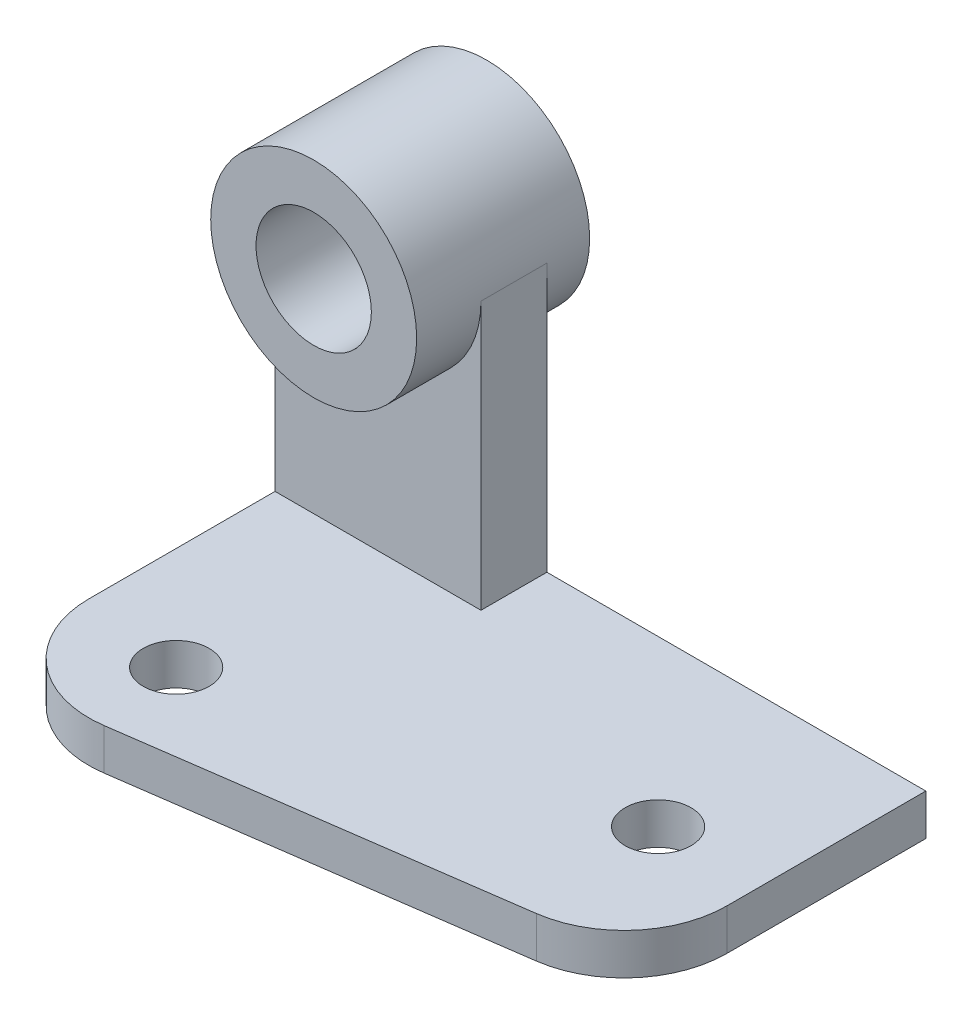
ISO-10303-21;
HEADER;
FILE_DESCRIPTION(('STEP AP214'),'2;1');
FILE_NAME('part.step','',(''),(''),'','','');
FILE_SCHEMA(('AUTOMOTIVE_DESIGN { 1 0 10303 214 1 1 1 1 }'));
ENDSEC;
DATA;
#1=APPLICATION_CONTEXT('core data for automotive mechanical design processes');
#2=APPLICATION_PROTOCOL_DEFINITION('international standard','automotive_design',2000,#1);
#3=PRODUCT_CONTEXT('',#1,'mechanical');
#4=PRODUCT('Part','Part','',(#3));
#5=PRODUCT_RELATED_PRODUCT_CATEGORY('part','',(#4));
#6=PRODUCT_DEFINITION_FORMATION('','',#4);
#7=PRODUCT_DEFINITION_CONTEXT('part definition',#1,'design');
#8=PRODUCT_DEFINITION('design','',#6,#7);
#9=PRODUCT_DEFINITION_SHAPE('','',#8);
#10=(LENGTH_UNIT() NAMED_UNIT(*) SI_UNIT(.MILLI.,.METRE.));
#11=(NAMED_UNIT(*) PLANE_ANGLE_UNIT() SI_UNIT($,.RADIAN.));
#12=(NAMED_UNIT(*) SI_UNIT($,.STERADIAN.) SOLID_ANGLE_UNIT());
#13=UNCERTAINTY_MEASURE_WITH_UNIT(LENGTH_MEASURE(1.E-05),#10,'distance_accuracy_value','');
#14=(GEOMETRIC_REPRESENTATION_CONTEXT(3) GLOBAL_UNCERTAINTY_ASSIGNED_CONTEXT((#13)) GLOBAL_UNIT_ASSIGNED_CONTEXT((#10,
#11,#12)) REPRESENTATION_CONTEXT('',''));
#15=CARTESIAN_POINT('',(0.,0.,0.));
#16=DIRECTION('',(0.,0.,1.));
#17=DIRECTION('',(1.,0.,0.));
#18=AXIS2_PLACEMENT_3D('',#15,#16,#17);
#19=CARTESIAN_POINT('',(-46.,10.,30.6160621336314));
#20=DIRECTION('',(0.,1.,0.));
#21=DIRECTION('',(0.,0.,1.));
#22=AXIS2_PLACEMENT_3D('',#19,#20,#21);
#23=PLANE('',#22);
#24=DIRECTION('',(0.,0.,-1.));
#25=VECTOR('',#24,1.);
#26=CARTESIAN_POINT('',(-21.,10.,-14.6160621336314));
#27=LINE('',#26,#25);
#28=CARTESIAN_POINT('',(-21.,10.,-14.6160621336314));
#29=VERTEX_POINT('',#28);
#30=CARTESIAN_POINT('',(-21.,10.,-30.6160621336314));
#31=VERTEX_POINT('',#30);
#32=EDGE_CURVE('E174',#29,#31,#27,.T.);
#33=ORIENTED_EDGE('',*,*,#32,.F.);
#34=DIRECTION('',(-1.,0.,0.));
#35=VECTOR('',#34,1.);
#36=CARTESIAN_POINT('',(-21.,10.,-14.6160621336314));
#37=LINE('',#36,#35);
#38=CARTESIAN_POINT('',(-71.,10.,-14.6160621336314));
#39=VERTEX_POINT('',#38);
#40=EDGE_CURVE('E181',#29,#39,#37,.T.);
#41=ORIENTED_EDGE('',*,*,#40,.T.);
#42=DIRECTION('',(0.,0.,1.));
#43=VECTOR('',#42,1.);
#44=CARTESIAN_POINT('',(-71.,10.,-30.6160621336314));
#45=LINE('',#44,#43);
#46=CARTESIAN_POINT('',(-71.,10.,30.6160621336314));
#47=VERTEX_POINT('',#46);
#48=EDGE_CURVE('E94',#39,#47,#45,.T.);
#49=ORIENTED_EDGE('',*,*,#48,.T.);
#50=CARTESIAN_POINT('',(-46.,10.,30.6160621336314));
#51=DIRECTION('',(0.,1.,0.));
#52=DIRECTION('',(0.,0.,1.));
#53=AXIS2_PLACEMENT_3D('',#50,#51,#52);
#54=CIRCLE('',#53,25.);
#55=CARTESIAN_POINT('',(-42.5132869538527,10.,55.3717247612774));
#56=VERTEX_POINT('',#55);
#57=EDGE_CURVE('E110',#47,#56,#54,.T.);
#58=ORIENTED_EDGE('',*,*,#57,.T.);
#59=DIRECTION('',(0.990226505105838,0.,-0.139468521845893));
#60=VECTOR('',#59,1.);
#61=CARTESIAN_POINT('',(-42.5132869538527,10.,55.3717247612774));
#62=LINE('',#61,#60);
#63=CARTESIAN_POINT('',(49.4867130461472,10.,42.4139782824042));
#64=VERTEX_POINT('',#63);
#65=EDGE_CURVE('E102',#56,#64,#62,.T.);
#66=ORIENTED_EDGE('',*,*,#65,.T.);
#67=CARTESIAN_POINT('',(46.,10.,17.6583156547582));
#68=DIRECTION('',(0.,1.,0.));
#69=DIRECTION('',(0.,0.,1.));
#70=AXIS2_PLACEMENT_3D('',#67,#68,#69);
#71=CIRCLE('',#70,25.);
#72=CARTESIAN_POINT('',(71.,10.,17.658315654758));
#73=VERTEX_POINT('',#72);
#74=EDGE_CURVE('E107',#64,#73,#71,.T.);
#75=ORIENTED_EDGE('',*,*,#74,.T.);
#76=DIRECTION('',(0.,0.,-1.));
#77=VECTOR('',#76,1.);
#78=CARTESIAN_POINT('',(71.,10.,17.658315654758));
#79=LINE('',#78,#77);
#80=CARTESIAN_POINT('',(71.,10.,-30.6160621336315));
#81=VERTEX_POINT('',#80);
#82=EDGE_CURVE('E60',#73,#81,#79,.T.);
#83=ORIENTED_EDGE('',*,*,#82,.T.);
#84=DIRECTION('',(-1.,0.,0.));
#85=VECTOR('',#84,1.);
#86=CARTESIAN_POINT('',(71.,10.,-30.6160621336315));
#87=LINE('',#86,#85);
#88=EDGE_CURVE('E143',#81,#31,#87,.T.);
#89=ORIENTED_EDGE('',*,*,#88,.T.);
#90=EDGE_LOOP('',(#33,#41,#49,#58,#66,#75,#83,#89));
#91=FACE_BOUND('',#90,.T.);
#92=CARTESIAN_POINT('',(46.,10.,9.38393786636855));
#93=DIRECTION('',(0.,1.,0.));
#94=DIRECTION('',(0.,0.,1.));
#95=AXIS2_PLACEMENT_3D('',#92,#93,#94);
#96=CIRCLE('',#95,8.00000000000001);
#97=CARTESIAN_POINT('',(46.,10.,17.3839378663686));
#98=VERTEX_POINT('',#97);
#99=EDGE_CURVE('E134',#98,#98,#96,.T.);
#100=ORIENTED_EDGE('',*,*,#99,.F.);
#101=EDGE_LOOP('',(#100));
#102=FACE_BOUND('',#101,.T.);
#103=CARTESIAN_POINT('',(-46.,10.,34.3839378663685));
#104=DIRECTION('',(0.,1.,0.));
#105=DIRECTION('',(0.,0.,1.));
#106=AXIS2_PLACEMENT_3D('',#103,#104,#105);
#107=CIRCLE('',#106,8.);
#108=CARTESIAN_POINT('',(-46.,10.,42.3839378663685));
#109=VERTEX_POINT('',#108);
#110=EDGE_CURVE('E168',#109,#109,#107,.T.);
#111=ORIENTED_EDGE('',*,*,#110,.F.);
#112=EDGE_LOOP('',(#111));
#113=FACE_BOUND('',#112,.T.);
#114=ADVANCED_FACE('F36',(#91,#102,#113),#23,.T.);
#115=CARTESIAN_POINT('',(-46.,0.,30.6160621336314));
#116=DIRECTION('',(0.,1.,0.));
#117=DIRECTION('',(0.,0.,1.));
#118=AXIS2_PLACEMENT_3D('',#115,#116,#117);
#119=PLANE('',#118);
#120=DIRECTION('',(-1.,0.,0.));
#121=VECTOR('',#120,1.);
#122=CARTESIAN_POINT('',(0.,0.,-30.6160621336314));
#123=LINE('',#122,#121);
#124=CARTESIAN_POINT('',(71.,0.,-30.6160621336315));
#125=VERTEX_POINT('',#124);
#126=CARTESIAN_POINT('',(-71.,0.,-30.6160621336314));
#127=VERTEX_POINT('',#126);
#128=EDGE_CURVE('E87',#125,#127,#123,.T.);
#129=ORIENTED_EDGE('',*,*,#128,.F.);
#130=DIRECTION('',(0.,0.,-1.));
#131=VECTOR('',#130,1.);
#132=CARTESIAN_POINT('',(71.,0.,17.658315654758));
#133=LINE('',#132,#131);
#134=CARTESIAN_POINT('',(71.,0.,17.658315654758));
#135=VERTEX_POINT('',#134);
#136=EDGE_CURVE('E141',#135,#125,#133,.T.);
#137=ORIENTED_EDGE('',*,*,#136,.F.);
#138=CARTESIAN_POINT('',(46.,0.,17.6583156547582));
#139=DIRECTION('',(0.,1.,0.));
#140=DIRECTION('',(0.,0.,1.));
#141=AXIS2_PLACEMENT_3D('',#138,#139,#140);
#142=CIRCLE('',#141,25.);
#143=CARTESIAN_POINT('',(49.4867130461472,0.,42.4139782824042));
#144=VERTEX_POINT('',#143);
#145=EDGE_CURVE('E139',#144,#135,#142,.T.);
#146=ORIENTED_EDGE('',*,*,#145,.F.);
#147=DIRECTION('',(0.990226505105838,0.,-0.139468521845893));
#148=VECTOR('',#147,1.);
#149=CARTESIAN_POINT('',(-42.5132869538527,0.,55.3717247612774));
#150=LINE('',#149,#148);
#151=CARTESIAN_POINT('',(-42.5132869538527,0.,55.3717247612774));
#152=VERTEX_POINT('',#151);
#153=EDGE_CURVE('E119',#152,#144,#150,.T.);
#154=ORIENTED_EDGE('',*,*,#153,.F.);
#155=CARTESIAN_POINT('',(-46.,0.,30.6160621336314));
#156=DIRECTION('',(0.,1.,0.));
#157=DIRECTION('',(0.,0.,1.));
#158=AXIS2_PLACEMENT_3D('',#155,#156,#157);
#159=CIRCLE('',#158,25.);
#160=CARTESIAN_POINT('',(-71.,0.,30.6160621336314));
#161=VERTEX_POINT('',#160);
#162=EDGE_CURVE('E136',#161,#152,#159,.T.);
#163=ORIENTED_EDGE('',*,*,#162,.F.);
#164=DIRECTION('',(0.,0.,1.));
#165=VECTOR('',#164,1.);
#166=CARTESIAN_POINT('',(-71.,0.,-30.6160621336314));
#167=LINE('',#166,#165);
#168=EDGE_CURVE('E133',#127,#161,#167,.T.);
#169=ORIENTED_EDGE('',*,*,#168,.F.);
#170=EDGE_LOOP('',(#129,#137,#146,#154,#163,#169));
#171=FACE_BOUND('',#170,.T.);
#172=CARTESIAN_POINT('',(46.,0.,9.38393786636855));
#173=DIRECTION('',(0.,1.,0.));
#174=DIRECTION('',(0.,0.,1.));
#175=AXIS2_PLACEMENT_3D('',#172,#173,#174);
#176=CIRCLE('',#175,8.00000000000001);
#177=CARTESIAN_POINT('',(46.,0.,17.3839378663686));
#178=VERTEX_POINT('',#177);
#179=EDGE_CURVE('E165',#178,#178,#176,.T.);
#180=ORIENTED_EDGE('',*,*,#179,.T.);
#181=EDGE_LOOP('',(#180));
#182=FACE_BOUND('',#181,.T.);
#183=CARTESIAN_POINT('',(-46.,0.,34.3839378663685));
#184=DIRECTION('',(0.,1.,0.));
#185=DIRECTION('',(0.,0.,1.));
#186=AXIS2_PLACEMENT_3D('',#183,#184,#185);
#187=CIRCLE('',#186,8.);
#188=CARTESIAN_POINT('',(-46.,0.,42.3839378663685));
#189=VERTEX_POINT('',#188);
#190=EDGE_CURVE('E171',#189,#189,#187,.T.);
#191=ORIENTED_EDGE('',*,*,#190,.T.);
#192=EDGE_LOOP('',(#191));
#193=FACE_BOUND('',#192,.T.);
#194=ADVANCED_FACE('F152',(#171,#182,#193),#119,.F.);
#195=CARTESIAN_POINT('',(0.,10.,-30.6160621336314));
#196=DIRECTION('',(0.,0.,1.));
#197=DIRECTION('',(1.,0.,0.));
#198=AXIS2_PLACEMENT_3D('',#195,#196,#197);
#199=PLANE('',#198);
#200=ORIENTED_EDGE('',*,*,#128,.T.);
#201=DIRECTION('',(0.,-1.,0.));
#202=VECTOR('',#201,1.);
#203=CARTESIAN_POINT('',(-71.,10.,-30.6160621336314));
#204=LINE('',#203,#202);
#205=CARTESIAN_POINT('',(-71.,75.,-30.6160621336314));
#206=VERTEX_POINT('',#205);
#207=EDGE_CURVE('E11',#206,#127,#204,.T.);
#208=ORIENTED_EDGE('',*,*,#207,.F.);
#209=CARTESIAN_POINT('',(-46.,75.,-30.6160621336314));
#210=DIRECTION('',(0.,0.,1.));
#211=DIRECTION('',(-1.,0.,0.));
#212=AXIS2_PLACEMENT_3D('',#209,#210,#211);
#213=CIRCLE('',#212,25.);
#214=CARTESIAN_POINT('',(-21.,75.,-30.6160621336314));
#215=VERTEX_POINT('',#214);
#216=EDGE_CURVE('E187',#206,#215,#213,.T.);
#217=ORIENTED_EDGE('',*,*,#216,.T.);
#218=DIRECTION('',(0.,-1.,0.));
#219=VECTOR('',#218,1.);
#220=CARTESIAN_POINT('',(-21.,75.,-30.6160621336314));
#221=LINE('',#220,#219);
#222=EDGE_CURVE('E161',#215,#31,#221,.T.);
#223=ORIENTED_EDGE('',*,*,#222,.T.);
#224=ORIENTED_EDGE('',*,*,#88,.F.);
#225=DIRECTION('',(0.,-1.,0.));
#226=VECTOR('',#225,1.);
#227=CARTESIAN_POINT('',(71.,10.,-30.6160621336315));
#228=LINE('',#227,#226);
#229=EDGE_CURVE('E128',#81,#125,#228,.T.);
#230=ORIENTED_EDGE('',*,*,#229,.T.);
#231=EDGE_LOOP('',(#200,#208,#217,#223,#224,#230));
#232=FACE_BOUND('',#231,.T.);
#233=ADVANCED_FACE('F38',(#232),#199,.F.);
#234=CARTESIAN_POINT('',(-71.,10.,-30.6160621336314));
#235=DIRECTION('',(1.,0.,0.));
#236=DIRECTION('',(0.,0.,-1.));
#237=AXIS2_PLACEMENT_3D('',#234,#235,#236);
#238=PLANE('',#237);
#239=ORIENTED_EDGE('',*,*,#168,.T.);
#240=DIRECTION('',(0.,-1.,0.));
#241=VECTOR('',#240,1.);
#242=CARTESIAN_POINT('',(-71.,10.,30.6160621336314));
#243=LINE('',#242,#241);
#244=EDGE_CURVE('E44',#47,#161,#243,.T.);
#245=ORIENTED_EDGE('',*,*,#244,.F.);
#246=ORIENTED_EDGE('',*,*,#48,.F.);
#247=DIRECTION('',(0.,1.,0.));
#248=VECTOR('',#247,1.);
#249=CARTESIAN_POINT('',(-71.,75.,-14.6160621336314));
#250=LINE('',#249,#248);
#251=CARTESIAN_POINT('',(-71.,75.,-14.6160621336314));
#252=VERTEX_POINT('',#251);
#253=EDGE_CURVE('E51',#39,#252,#250,.T.);
#254=ORIENTED_EDGE('',*,*,#253,.T.);
#255=DIRECTION('',(0.,0.,-1.));
#256=VECTOR('',#255,1.);
#257=CARTESIAN_POINT('',(-71.,75.,-14.6160621336314));
#258=LINE('',#257,#256);
#259=EDGE_CURVE('E177',#252,#206,#258,.T.);
#260=ORIENTED_EDGE('',*,*,#259,.T.);
#261=ORIENTED_EDGE('',*,*,#207,.T.);
#262=EDGE_LOOP('',(#239,#245,#246,#254,#260,#261));
#263=FACE_BOUND('',#262,.T.);
#264=ADVANCED_FACE('F245',(#263),#238,.F.);
#265=CARTESIAN_POINT('',(-46.,10.,30.6160621336314));
#266=DIRECTION('',(0.,-1.,0.));
#267=DIRECTION('',(0.,0.,-1.));
#268=AXIS2_PLACEMENT_3D('',#265,#266,#267);
#269=CYLINDRICAL_SURFACE('',#268,25.);
#270=ORIENTED_EDGE('',*,*,#162,.T.);
#271=DIRECTION('',(0.,-1.,0.));
#272=VECTOR('',#271,1.);
#273=CARTESIAN_POINT('',(-42.5132869538527,10.,55.3717247612774));
#274=LINE('',#273,#272);
#275=EDGE_CURVE('E122',#56,#152,#274,.T.);
#276=ORIENTED_EDGE('',*,*,#275,.F.);
#277=ORIENTED_EDGE('',*,*,#57,.F.);
#278=ORIENTED_EDGE('',*,*,#244,.T.);
#279=EDGE_LOOP('',(#270,#276,#277,#278));
#280=FACE_BOUND('',#279,.T.);
#281=ADVANCED_FACE('F150',(#280),#269,.T.);
#282=CARTESIAN_POINT('',(-42.5132869538527,10.,55.3717247612774));
#283=DIRECTION('',(-0.139468521845893,0.,-0.990226505105838));
#284=DIRECTION('',(-0.990226505105838,0.,0.139468521845893));
#285=AXIS2_PLACEMENT_3D('',#282,#283,#284);
#286=PLANE('',#285);
#287=ORIENTED_EDGE('',*,*,#153,.T.);
#288=DIRECTION('',(0.,-1.,0.));
#289=VECTOR('',#288,1.);
#290=CARTESIAN_POINT('',(49.4867130461472,10.,42.4139782824042));
#291=LINE('',#290,#289);
#292=EDGE_CURVE('E116',#64,#144,#291,.T.);
#293=ORIENTED_EDGE('',*,*,#292,.F.);
#294=ORIENTED_EDGE('',*,*,#65,.F.);
#295=ORIENTED_EDGE('',*,*,#275,.T.);
#296=EDGE_LOOP('',(#287,#293,#294,#295));
#297=FACE_BOUND('',#296,.T.);
#298=ADVANCED_FACE('F117',(#297),#286,.F.);
#299=CARTESIAN_POINT('',(46.,10.,17.6583156547582));
#300=DIRECTION('',(0.,-1.,0.));
#301=DIRECTION('',(0.,0.,-1.));
#302=AXIS2_PLACEMENT_3D('',#299,#300,#301);
#303=CYLINDRICAL_SURFACE('',#302,25.);
#304=ORIENTED_EDGE('',*,*,#145,.T.);
#305=DIRECTION('',(0.,-1.,0.));
#306=VECTOR('',#305,1.);
#307=CARTESIAN_POINT('',(71.,10.,17.658315654758));
#308=LINE('',#307,#306);
#309=EDGE_CURVE('E123',#73,#135,#308,.T.);
#310=ORIENTED_EDGE('',*,*,#309,.F.);
#311=ORIENTED_EDGE('',*,*,#74,.F.);
#312=ORIENTED_EDGE('',*,*,#292,.T.);
#313=EDGE_LOOP('',(#304,#310,#311,#312));
#314=FACE_BOUND('',#313,.T.);
#315=ADVANCED_FACE('F125',(#314),#303,.T.);
#316=CARTESIAN_POINT('',(71.,10.,17.658315654758));
#317=DIRECTION('',(-1.,0.,0.));
#318=DIRECTION('',(0.,0.,1.));
#319=AXIS2_PLACEMENT_3D('',#316,#317,#318);
#320=PLANE('',#319);
#321=ORIENTED_EDGE('',*,*,#136,.T.);
#322=ORIENTED_EDGE('',*,*,#229,.F.);
#323=ORIENTED_EDGE('',*,*,#82,.F.);
#324=ORIENTED_EDGE('',*,*,#309,.T.);
#325=EDGE_LOOP('',(#321,#322,#323,#324));
#326=FACE_BOUND('',#325,.T.);
#327=ADVANCED_FACE('F155',(#326),#320,.F.);
#328=CARTESIAN_POINT('',(46.,10.,9.38393786636855));
#329=DIRECTION('',(0.,-1.,0.));
#330=DIRECTION('',(0.,0.,-1.));
#331=AXIS2_PLACEMENT_3D('',#328,#329,#330);
#332=CYLINDRICAL_SURFACE('',#331,8.00000000000001);
#333=ORIENTED_EDGE('',*,*,#99,.T.);
#334=EDGE_LOOP('',(#333));
#335=FACE_BOUND('',#334,.T.);
#336=ORIENTED_EDGE('',*,*,#179,.F.);
#337=EDGE_LOOP('',(#336));
#338=FACE_BOUND('',#337,.T.);
#339=ADVANCED_FACE('F235',(#335,#338),#332,.F.);
#340=CARTESIAN_POINT('',(-46.,10.,34.3839378663685));
#341=DIRECTION('',(0.,-1.,0.));
#342=DIRECTION('',(0.,0.,-1.));
#343=AXIS2_PLACEMENT_3D('',#340,#341,#342);
#344=CYLINDRICAL_SURFACE('',#343,8.);
#345=ORIENTED_EDGE('',*,*,#110,.T.);
#346=EDGE_LOOP('',(#345));
#347=FACE_BOUND('',#346,.T.);
#348=ORIENTED_EDGE('',*,*,#190,.F.);
#349=EDGE_LOOP('',(#348));
#350=FACE_BOUND('',#349,.T.);
#351=ADVANCED_FACE('F278',(#347,#350),#344,.F.);
#352=CARTESIAN_POINT('',(-21.,75.,-14.6160621336314));
#353=DIRECTION('',(1.,0.,0.));
#354=DIRECTION('',(0.,0.,-1.));
#355=AXIS2_PLACEMENT_3D('',#352,#353,#354);
#356=PLANE('',#355);
#357=ORIENTED_EDGE('',*,*,#222,.F.);
#358=DIRECTION('',(0.,0.,-1.));
#359=VECTOR('',#358,1.);
#360=CARTESIAN_POINT('',(-21.,75.,-14.6160621336314));
#361=LINE('',#360,#359);
#362=CARTESIAN_POINT('',(-21.,75.,-14.6160621336314));
#363=VERTEX_POINT('',#362);
#364=EDGE_CURVE('E180',#363,#215,#361,.T.);
#365=ORIENTED_EDGE('',*,*,#364,.F.);
#366=DIRECTION('',(0.,-1.,0.));
#367=VECTOR('',#366,1.);
#368=CARTESIAN_POINT('',(-21.,75.,-14.6160621336314));
#369=LINE('',#368,#367);
#370=EDGE_CURVE('E191',#363,#29,#369,.T.);
#371=ORIENTED_EDGE('',*,*,#370,.T.);
#372=ORIENTED_EDGE('',*,*,#32,.T.);
#373=EDGE_LOOP('',(#357,#365,#371,#372));
#374=FACE_BOUND('',#373,.T.);
#375=ADVANCED_FACE('F264',(#374),#356,.T.);
#376=CARTESIAN_POINT('',(-46.,75.,-14.6160621336314));
#377=DIRECTION('',(0.,0.,-1.));
#378=DIRECTION('',(-1.,0.,0.));
#379=AXIS2_PLACEMENT_3D('',#376,#377,#378);
#380=PLANE('',#379);
#381=ORIENTED_EDGE('',*,*,#253,.F.);
#382=ORIENTED_EDGE('',*,*,#40,.F.);
#383=ORIENTED_EDGE('',*,*,#370,.F.);
#384=CARTESIAN_POINT('',(-46.,75.,-14.6160621336314));
#385=DIRECTION('',(0.,0.,1.));
#386=DIRECTION('',(-1.,0.,0.));
#387=AXIS2_PLACEMENT_3D('',#384,#385,#386);
#388=CIRCLE('',#387,25.);
#389=EDGE_CURVE('E194',#252,#363,#388,.T.);
#390=ORIENTED_EDGE('',*,*,#389,.F.);
#391=EDGE_LOOP('',(#381,#382,#383,#390));
#392=FACE_BOUND('',#391,.T.);
#393=ADVANCED_FACE('F268',(#392),#380,.F.);
#394=CARTESIAN_POINT('',(-46.,75.,1.));
#395=DIRECTION('',(0.,0.,-1.));
#396=DIRECTION('',(-1.,0.,0.));
#397=AXIS2_PLACEMENT_3D('',#394,#395,#396);
#398=CYLINDRICAL_SURFACE('',#397,25.);
#399=CARTESIAN_POINT('',(-46.,75.,1.));
#400=DIRECTION('',(0.,0.,1.));
#401=DIRECTION('',(1.,0.,0.));
#402=AXIS2_PLACEMENT_3D('',#399,#400,#401);
#403=CIRCLE('',#402,25.);
#404=CARTESIAN_POINT('',(-21.,75.,1.));
#405=VERTEX_POINT('',#404);
#406=EDGE_CURVE('E189',#405,#405,#403,.T.);
#407=ORIENTED_EDGE('',*,*,#406,.F.);
#408=EDGE_LOOP('',(#407));
#409=FACE_BOUND('',#408,.T.);
#410=CARTESIAN_POINT('',(-46.,75.,-41.));
#411=DIRECTION('',(0.,0.,1.));
#412=DIRECTION('',(1.,0.,0.));
#413=AXIS2_PLACEMENT_3D('',#410,#411,#412);
#414=CIRCLE('',#413,25.);
#415=CARTESIAN_POINT('',(-21.,75.,-41.));
#416=VERTEX_POINT('',#415);
#417=EDGE_CURVE('E203',#416,#416,#414,.T.);
#418=ORIENTED_EDGE('',*,*,#417,.T.);
#419=EDGE_LOOP('',(#418));
#420=FACE_BOUND('',#419,.T.);
#421=ORIENTED_EDGE('',*,*,#364,.T.);
#422=ORIENTED_EDGE('',*,*,#216,.F.);
#423=ORIENTED_EDGE('',*,*,#259,.F.);
#424=ORIENTED_EDGE('',*,*,#389,.T.);
#425=EDGE_LOOP('',(#421,#422,#423,#424));
#426=FACE_BOUND('',#425,.T.);
#427=ADVANCED_FACE('F223',(#409,#420,#426),#398,.T.);
#428=CARTESIAN_POINT('',(-46.,75.,1.));
#429=DIRECTION('',(0.,0.,1.));
#430=DIRECTION('',(1.,0.,0.));
#431=AXIS2_PLACEMENT_3D('',#428,#429,#430);
#432=PLANE('',#431);
#433=ORIENTED_EDGE('',*,*,#406,.T.);
#434=EDGE_LOOP('',(#433));
#435=FACE_BOUND('',#434,.T.);
#436=CARTESIAN_POINT('',(-46.,75.,1.));
#437=DIRECTION('',(0.,0.,1.));
#438=DIRECTION('',(1.,0.,0.));
#439=AXIS2_PLACEMENT_3D('',#436,#437,#438);
#440=CIRCLE('',#439,14.);
#441=CARTESIAN_POINT('',(-32.,75.,1.));
#442=VERTEX_POINT('',#441);
#443=EDGE_CURVE('E200',#442,#442,#440,.T.);
#444=ORIENTED_EDGE('',*,*,#443,.F.);
#445=EDGE_LOOP('',(#444));
#446=FACE_BOUND('',#445,.T.);
#447=ADVANCED_FACE('F215',(#435,#446),#432,.T.);
#448=CARTESIAN_POINT('',(-46.,75.,1.));
#449=DIRECTION('',(0.,0.,-1.));
#450=DIRECTION('',(-1.,0.,0.));
#451=AXIS2_PLACEMENT_3D('',#448,#449,#450);
#452=CYLINDRICAL_SURFACE('',#451,14.);
#453=ORIENTED_EDGE('',*,*,#443,.T.);
#454=EDGE_LOOP('',(#453));
#455=FACE_BOUND('',#454,.T.);
#456=CARTESIAN_POINT('',(-46.,75.,-41.));
#457=DIRECTION('',(0.,0.,1.));
#458=DIRECTION('',(1.,0.,0.));
#459=AXIS2_PLACEMENT_3D('',#456,#457,#458);
#460=CIRCLE('',#459,14.);
#461=CARTESIAN_POINT('',(-32.,75.,-41.));
#462=VERTEX_POINT('',#461);
#463=EDGE_CURVE('E206',#462,#462,#460,.T.);
#464=ORIENTED_EDGE('',*,*,#463,.F.);
#465=EDGE_LOOP('',(#464));
#466=FACE_BOUND('',#465,.T.);
#467=ADVANCED_FACE('F213',(#455,#466),#452,.F.);
#468=CARTESIAN_POINT('',(-46.,75.,-41.));
#469=DIRECTION('',(0.,0.,1.));
#470=DIRECTION('',(1.,0.,0.));
#471=AXIS2_PLACEMENT_3D('',#468,#469,#470);
#472=PLANE('',#471);
#473=ORIENTED_EDGE('',*,*,#463,.T.);
#474=EDGE_LOOP('',(#473));
#475=FACE_BOUND('',#474,.T.);
#476=ORIENTED_EDGE('',*,*,#417,.F.);
#477=EDGE_LOOP('',(#476));
#478=FACE_BOUND('',#477,.T.);
#479=ADVANCED_FACE('F210',(#475,#478),#472,.F.);
#480=CLOSED_SHELL('',(#114,#194,#233,#264,#281,#298,#315,#327,#339,#351,#375,#393,#427,#447,
#467,#479));
#481=MANIFOLD_SOLID_BREP('B2',#480);
#482=ADVANCED_BREP_SHAPE_REPRESENTATION('',(#18,#481),#14);
#483=SHAPE_DEFINITION_REPRESENTATION(#9,#482);
ENDSEC;
END-ISO-10303-21;
